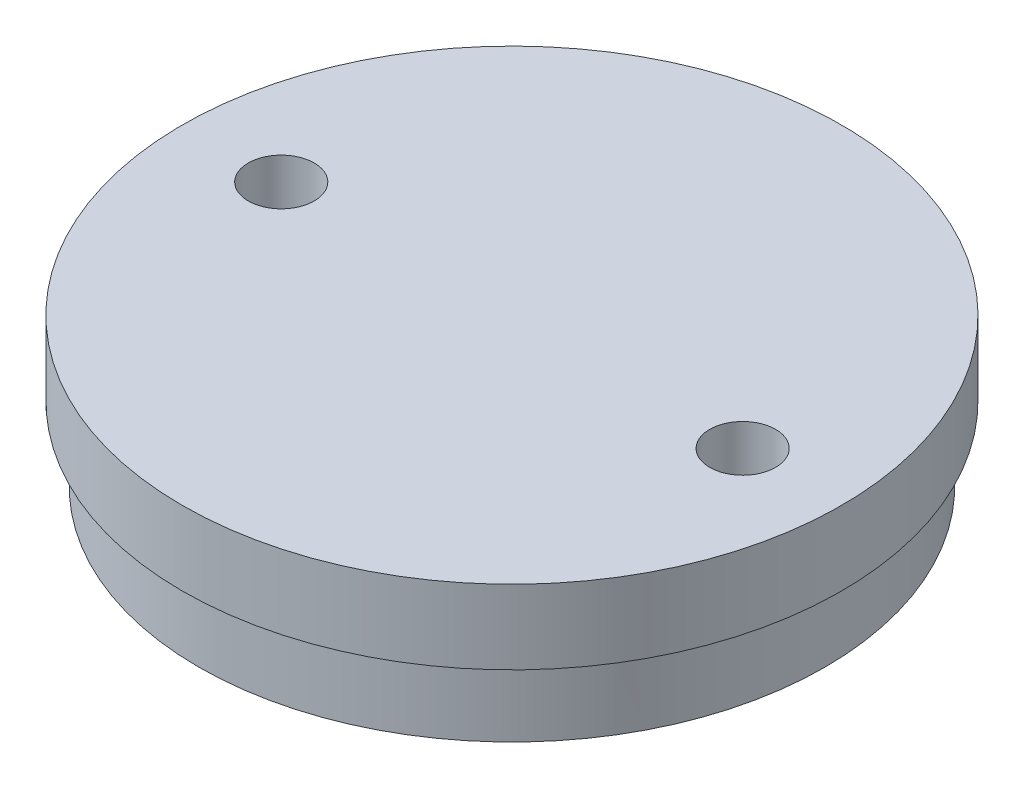
ISO-10303-21;
HEADER;
FILE_DESCRIPTION(('STEP AP214'),'2;1');
FILE_NAME('part.step','',(''),(''),'','','');
FILE_SCHEMA(('AUTOMOTIVE_DESIGN { 1 0 10303 214 1 1 1 1 }'));
ENDSEC;
DATA;
#1=APPLICATION_CONTEXT('core data for automotive mechanical design processes');
#2=APPLICATION_PROTOCOL_DEFINITION('international standard','automotive_design',2000,#1);
#3=PRODUCT_CONTEXT('',#1,'mechanical');
#4=PRODUCT('Part','Part','',(#3));
#5=PRODUCT_RELATED_PRODUCT_CATEGORY('part','',(#4));
#6=PRODUCT_DEFINITION_FORMATION('','',#4);
#7=PRODUCT_DEFINITION_CONTEXT('part definition',#1,'design');
#8=PRODUCT_DEFINITION('design','',#6,#7);
#9=PRODUCT_DEFINITION_SHAPE('','',#8);
#10=(LENGTH_UNIT() NAMED_UNIT(*) SI_UNIT(.MILLI.,.METRE.));
#11=(NAMED_UNIT(*) PLANE_ANGLE_UNIT() SI_UNIT($,.RADIAN.));
#12=(NAMED_UNIT(*) SI_UNIT($,.STERADIAN.) SOLID_ANGLE_UNIT());
#13=UNCERTAINTY_MEASURE_WITH_UNIT(LENGTH_MEASURE(1.E-05),#10,'distance_accuracy_value','');
#14=(GEOMETRIC_REPRESENTATION_CONTEXT(3) GLOBAL_UNCERTAINTY_ASSIGNED_CONTEXT((#13)) GLOBAL_UNIT_ASSIGNED_CONTEXT((#10,
#11,#12)) REPRESENTATION_CONTEXT('',''));
#15=CARTESIAN_POINT('',(0.,0.,0.));
#16=DIRECTION('',(0.,0.,1.));
#17=DIRECTION('',(1.,0.,0.));
#18=AXIS2_PLACEMENT_3D('',#15,#16,#17);
#19=CARTESIAN_POINT('',(0.,9.,0.));
#20=DIRECTION('',(0.,-1.,0.));
#21=DIRECTION('',(0.,0.,-1.));
#22=AXIS2_PLACEMENT_3D('',#19,#20,#21);
#23=CYLINDRICAL_SURFACE('',#22,40.);
#24=CARTESIAN_POINT('',(0.,9.,0.));
#25=DIRECTION('',(0.,1.,0.));
#26=DIRECTION('',(0.,0.,1.));
#27=AXIS2_PLACEMENT_3D('',#24,#25,#26);
#28=CIRCLE('',#27,40.);
#29=CARTESIAN_POINT('',(0.,9.,40.));
#30=VERTEX_POINT('',#29);
#31=EDGE_CURVE('E39',#30,#30,#28,.T.);
#32=ORIENTED_EDGE('',*,*,#31,.F.);
#33=EDGE_LOOP('',(#32));
#34=FACE_BOUND('',#33,.T.);
#35=CARTESIAN_POINT('',(0.,0.,0.));
#36=DIRECTION('',(0.,1.,0.));
#37=DIRECTION('',(0.,0.,1.));
#38=AXIS2_PLACEMENT_3D('',#35,#36,#37);
#39=CIRCLE('',#38,40.);
#40=CARTESIAN_POINT('',(0.,0.,40.));
#41=VERTEX_POINT('',#40);
#42=EDGE_CURVE('E43',#41,#41,#39,.T.);
#43=ORIENTED_EDGE('',*,*,#42,.T.);
#44=EDGE_LOOP('',(#43));
#45=FACE_BOUND('',#44,.T.);
#46=ADVANCED_FACE('F33',(#34,#45),#23,.T.);
#47=CARTESIAN_POINT('',(0.,9.,0.));
#48=DIRECTION('',(0.,1.,0.));
#49=DIRECTION('',(0.,0.,1.));
#50=AXIS2_PLACEMENT_3D('',#47,#48,#49);
#51=PLANE('',#50);
#52=CARTESIAN_POINT('',(28.,9.,0.));
#53=DIRECTION('',(0.,-1.,0.));
#54=DIRECTION('',(0.,0.,-1.));
#55=AXIS2_PLACEMENT_3D('',#52,#53,#54);
#56=CIRCLE('',#55,4.);
#57=CARTESIAN_POINT('',(28.,9.,-4.));
#58=VERTEX_POINT('',#57);
#59=EDGE_CURVE('E64',#58,#58,#56,.T.);
#60=ORIENTED_EDGE('',*,*,#59,.T.);
#61=EDGE_LOOP('',(#60));
#62=FACE_BOUND('',#61,.T.);
#63=CARTESIAN_POINT('',(-28.,9.,0.));
#64=DIRECTION('',(0.,-1.,0.));
#65=DIRECTION('',(0.,0.,-1.));
#66=AXIS2_PLACEMENT_3D('',#63,#64,#65);
#67=CIRCLE('',#66,4.);
#68=CARTESIAN_POINT('',(-28.,9.,-4.));
#69=VERTEX_POINT('',#68);
#70=EDGE_CURVE('E56',#69,#69,#67,.T.);
#71=ORIENTED_EDGE('',*,*,#70,.T.);
#72=EDGE_LOOP('',(#71));
#73=FACE_BOUND('',#72,.T.);
#74=ORIENTED_EDGE('',*,*,#31,.T.);
#75=EDGE_LOOP('',(#74));
#76=FACE_BOUND('',#75,.T.);
#77=ADVANCED_FACE('F97',(#62,#73,#76),#51,.T.);
#78=CARTESIAN_POINT('',(0.,0.,0.));
#79=DIRECTION('',(0.,1.,0.));
#80=DIRECTION('',(0.,0.,1.));
#81=AXIS2_PLACEMENT_3D('',#78,#79,#80);
#82=PLANE('',#81);
#83=CARTESIAN_POINT('',(0.,0.,0.));
#84=DIRECTION('',(0.,1.,0.));
#85=DIRECTION('',(0.,0.,1.));
#86=AXIS2_PLACEMENT_3D('',#83,#84,#85);
#87=CIRCLE('',#86,38.);
#88=CARTESIAN_POINT('',(0.,0.,38.));
#89=VERTEX_POINT('',#88);
#90=EDGE_CURVE('E10',#89,#89,#87,.F.);
#91=ORIENTED_EDGE('',*,*,#90,.F.);
#92=EDGE_LOOP('',(#91));
#93=FACE_BOUND('',#92,.T.);
#94=ORIENTED_EDGE('',*,*,#42,.F.);
#95=EDGE_LOOP('',(#94));
#96=FACE_BOUND('',#95,.T.);
#97=ADVANCED_FACE('F78',(#93,#96),#82,.F.);
#98=CARTESIAN_POINT('',(0.,-9.,0.));
#99=DIRECTION('',(0.,-1.,0.));
#100=DIRECTION('',(0.,0.,-1.));
#101=AXIS2_PLACEMENT_3D('',#98,#99,#100);
#102=PLANE('',#101);
#103=CARTESIAN_POINT('',(0.,-9.,0.));
#104=DIRECTION('',(0.,-1.,0.));
#105=DIRECTION('',(0.,0.,-1.));
#106=AXIS2_PLACEMENT_3D('',#103,#104,#105);
#107=CIRCLE('',#106,38.);
#108=CARTESIAN_POINT('',(0.,-9.,-38.));
#109=VERTEX_POINT('',#108);
#110=EDGE_CURVE('E48',#109,#109,#107,.T.);
#111=ORIENTED_EDGE('',*,*,#110,.T.);
#112=EDGE_LOOP('',(#111));
#113=FACE_BOUND('',#112,.T.);
#114=CARTESIAN_POINT('',(0.,-9.,0.));
#115=DIRECTION('',(0.,-1.,0.));
#116=DIRECTION('',(0.,0.,-1.));
#117=AXIS2_PLACEMENT_3D('',#114,#115,#116);
#118=CIRCLE('',#117,33.);
#119=CARTESIAN_POINT('',(0.,-9.,-33.));
#120=VERTEX_POINT('',#119);
#121=EDGE_CURVE('E52',#120,#120,#118,.T.);
#122=ORIENTED_EDGE('',*,*,#121,.F.);
#123=EDGE_LOOP('',(#122));
#124=FACE_BOUND('',#123,.T.);
#125=ADVANCED_FACE('F91',(#113,#124),#102,.T.);
#126=CARTESIAN_POINT('',(0.,-9.,0.));
#127=DIRECTION('',(0.,1.,0.));
#128=DIRECTION('',(0.,0.,1.));
#129=AXIS2_PLACEMENT_3D('',#126,#127,#128);
#130=CYLINDRICAL_SURFACE('',#129,38.);
#131=ORIENTED_EDGE('',*,*,#110,.F.);
#132=EDGE_LOOP('',(#131));
#133=FACE_BOUND('',#132,.T.);
#134=ORIENTED_EDGE('',*,*,#90,.T.);
#135=EDGE_LOOP('',(#134));
#136=FACE_BOUND('',#135,.T.);
#137=ADVANCED_FACE('F84',(#133,#136),#130,.T.);
#138=CARTESIAN_POINT('',(0.,-9.,0.));
#139=DIRECTION('',(0.,1.,0.));
#140=DIRECTION('',(0.,0.,1.));
#141=AXIS2_PLACEMENT_3D('',#138,#139,#140);
#142=CYLINDRICAL_SURFACE('',#141,33.);
#143=ORIENTED_EDGE('',*,*,#121,.T.);
#144=EDGE_LOOP('',(#143));
#145=FACE_BOUND('',#144,.T.);
#146=CARTESIAN_POINT('',(0.,0.,0.));
#147=DIRECTION('',(0.,-1.,0.));
#148=DIRECTION('',(0.,0.,-1.));
#149=AXIS2_PLACEMENT_3D('',#146,#147,#148);
#150=CIRCLE('',#149,33.);
#151=CARTESIAN_POINT('',(0.,0.,-33.));
#152=VERTEX_POINT('',#151);
#153=EDGE_CURVE('E53',#152,#152,#150,.T.);
#154=ORIENTED_EDGE('',*,*,#153,.F.);
#155=EDGE_LOOP('',(#154));
#156=FACE_BOUND('',#155,.T.);
#157=ADVANCED_FACE('F77',(#145,#156),#142,.F.);
#158=CARTESIAN_POINT('',(28.,0.,0.));
#159=DIRECTION('',(0.,-1.,0.));
#160=DIRECTION('',(0.,0.,-1.));
#161=AXIS2_PLACEMENT_3D('',#158,#159,#160);
#162=CIRCLE('',#161,4.);
#163=CARTESIAN_POINT('',(28.,0.,-4.));
#164=VERTEX_POINT('',#163);
#165=EDGE_CURVE('E67',#164,#164,#162,.T.);
#166=ORIENTED_EDGE('',*,*,#165,.F.);
#167=EDGE_LOOP('',(#166));
#168=FACE_BOUND('',#167,.T.);
#169=CARTESIAN_POINT('',(-28.,0.,0.));
#170=DIRECTION('',(0.,-1.,0.));
#171=DIRECTION('',(0.,0.,-1.));
#172=AXIS2_PLACEMENT_3D('',#169,#170,#171);
#173=CIRCLE('',#172,4.);
#174=CARTESIAN_POINT('',(-28.,0.,-4.));
#175=VERTEX_POINT('',#174);
#176=EDGE_CURVE('E61',#175,#175,#173,.T.);
#177=ORIENTED_EDGE('',*,*,#176,.F.);
#178=EDGE_LOOP('',(#177));
#179=FACE_BOUND('',#178,.T.);
#180=ORIENTED_EDGE('',*,*,#153,.T.);
#181=EDGE_LOOP('',(#180));
#182=FACE_BOUND('',#181,.T.);
#183=ADVANCED_FACE('F73',(#168,#179,#182),#82,.F.);
#184=CARTESIAN_POINT('',(-28.,0.,0.));
#185=DIRECTION('',(0.,-1.,0.));
#186=DIRECTION('',(0.,0.,-1.));
#187=AXIS2_PLACEMENT_3D('',#184,#185,#186);
#188=CYLINDRICAL_SURFACE('',#187,4.);
#189=ORIENTED_EDGE('',*,*,#70,.F.);
#190=EDGE_LOOP('',(#189));
#191=FACE_BOUND('',#190,.T.);
#192=ORIENTED_EDGE('',*,*,#176,.T.);
#193=EDGE_LOOP('',(#192));
#194=FACE_BOUND('',#193,.T.);
#195=ADVANCED_FACE('F76',(#191,#194),#188,.F.);
#196=CARTESIAN_POINT('',(28.,0.,0.));
#197=DIRECTION('',(0.,-1.,0.));
#198=DIRECTION('',(0.,0.,-1.));
#199=AXIS2_PLACEMENT_3D('',#196,#197,#198);
#200=CYLINDRICAL_SURFACE('',#199,4.);
#201=ORIENTED_EDGE('',*,*,#59,.F.);
#202=EDGE_LOOP('',(#201));
#203=FACE_BOUND('',#202,.T.);
#204=ORIENTED_EDGE('',*,*,#165,.T.);
#205=EDGE_LOOP('',(#204));
#206=FACE_BOUND('',#205,.T.);
#207=ADVANCED_FACE('F71',(#203,#206),#200,.F.);
#208=CLOSED_SHELL('',(#46,#77,#97,#125,#137,#157,#183,#195,#207));
#209=MANIFOLD_SOLID_BREP('B2',#208);
#210=ADVANCED_BREP_SHAPE_REPRESENTATION('',(#18,#209),#14);
#211=SHAPE_DEFINITION_REPRESENTATION(#9,#210);
ENDSEC;
END-ISO-10303-21;
